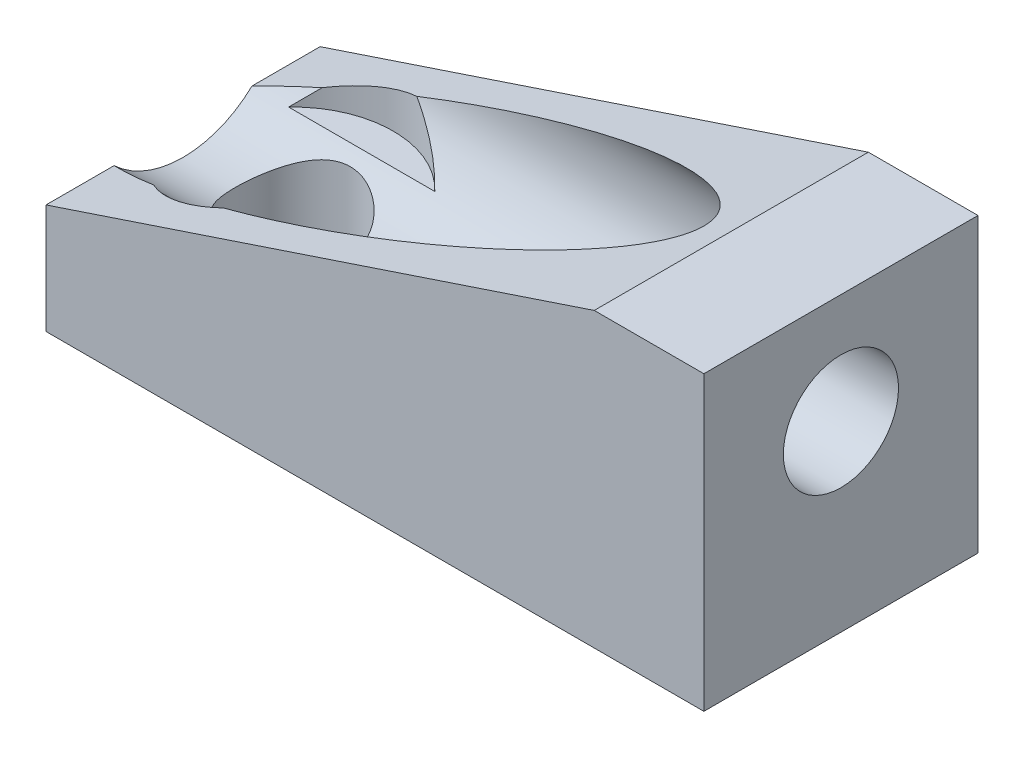
ISO-10303-21;
HEADER;
FILE_DESCRIPTION(('STEP AP214'),'2;1');
FILE_NAME('part.step','',(''),(''),'','','');
FILE_SCHEMA(('AUTOMOTIVE_DESIGN { 1 0 10303 214 1 1 1 1 }'));
ENDSEC;
DATA;
#1=APPLICATION_CONTEXT('core data for automotive mechanical design processes');
#2=APPLICATION_PROTOCOL_DEFINITION('international standard','automotive_design',2000,#1);
#3=PRODUCT_CONTEXT('',#1,'mechanical');
#4=PRODUCT('Part','Part','',(#3));
#5=PRODUCT_RELATED_PRODUCT_CATEGORY('part','',(#4));
#6=PRODUCT_DEFINITION_FORMATION('','',#4);
#7=PRODUCT_DEFINITION_CONTEXT('part definition',#1,'design');
#8=PRODUCT_DEFINITION('design','',#6,#7);
#9=PRODUCT_DEFINITION_SHAPE('','',#8);
#10=(LENGTH_UNIT() NAMED_UNIT(*) SI_UNIT(.MILLI.,.METRE.));
#11=(NAMED_UNIT(*) PLANE_ANGLE_UNIT() SI_UNIT($,.RADIAN.));
#12=(NAMED_UNIT(*) SI_UNIT($,.STERADIAN.) SOLID_ANGLE_UNIT());
#13=UNCERTAINTY_MEASURE_WITH_UNIT(LENGTH_MEASURE(1.E-05),#10,'distance_accuracy_value','');
#14=(GEOMETRIC_REPRESENTATION_CONTEXT(3) GLOBAL_UNCERTAINTY_ASSIGNED_CONTEXT((#13)) GLOBAL_UNIT_ASSIGNED_CONTEXT((#10,
#11,#12)) REPRESENTATION_CONTEXT('',''));
#15=CARTESIAN_POINT('',(0.,0.,0.));
#16=DIRECTION('',(0.,0.,1.));
#17=DIRECTION('',(1.,0.,0.));
#18=AXIS2_PLACEMENT_3D('',#15,#16,#17);
#19=CARTESIAN_POINT('',(8.34684153005472,6.,7.5));
#20=DIRECTION('',(0.,1.,0.));
#21=DIRECTION('',(0.,0.,1.));
#22=AXIS2_PLACEMENT_3D('',#19,#20,#21);
#23=CYLINDRICAL_SURFACE('',#22,5.5);
#24=CARTESIAN_POINT('',(8.34684153005472,10.,7.5));
#25=DIRECTION('',(-0.707106781186547,0.707106781186547,0.));
#26=DIRECTION('',(0.707106781186547,0.707106781186547,0.));
#27=AXIS2_PLACEMENT_3D('',#24,#25,#26);
#28=ELLIPSE('',#27,7.77817459305202,5.5);
#29=CARTESIAN_POINT('',(5.34684153005472,7.,12.1097722286464));
#30=VERTEX_POINT('',#29);
#31=CARTESIAN_POINT('',(4.34684153005472,6.,11.2749172176354));
#32=VERTEX_POINT('',#31);
#33=EDGE_CURVE('E63',#30,#32,#28,.F.);
#34=ORIENTED_EDGE('',*,*,#33,.F.);
#35=CARTESIAN_POINT('',(8.34684153005472,8.,7.5));
#36=DIRECTION('',(-0.316227766016838,0.948683298050514,0.));
#37=DIRECTION('',(0.948683298050514,0.316227766016838,0.));
#38=AXIS2_PLACEMENT_3D('',#35,#36,#37);
#39=ELLIPSE('',#38,5.79750904364202,5.5);
#40=CARTESIAN_POINT('',(9.84684153005471,8.5,12.7915026221292));
#41=VERTEX_POINT('',#40);
#42=EDGE_CURVE('E168',#30,#41,#39,.T.);
#43=ORIENTED_EDGE('',*,*,#42,.T.);
#44=CARTESIAN_POINT('',(8.34684153005472,10.,7.5));
#45=DIRECTION('',(0.707106781186547,0.707106781186547,0.));
#46=DIRECTION('',(-0.707106781186547,0.707106781186547,0.));
#47=AXIS2_PLACEMENT_3D('',#44,#45,#46);
#48=ELLIPSE('',#47,7.77817459305202,5.5);
#49=CARTESIAN_POINT('',(12.3468415300547,6.,11.2749172176354));
#50=VERTEX_POINT('',#49);
#51=EDGE_CURVE('E185',#50,#41,#48,.F.);
#52=ORIENTED_EDGE('',*,*,#51,.F.);
#53=CARTESIAN_POINT('',(8.34684153005472,6.,7.5));
#54=DIRECTION('',(0.,1.,0.));
#55=DIRECTION('',(0.,0.,1.));
#56=AXIS2_PLACEMENT_3D('',#53,#54,#55);
#57=CIRCLE('',#56,5.5);
#58=EDGE_CURVE('E179',#32,#50,#57,.T.);
#59=ORIENTED_EDGE('',*,*,#58,.F.);
#60=EDGE_LOOP('',(#34,#43,#52,#59));
#61=FACE_BOUND('',#60,.T.);
#62=ADVANCED_FACE('F47',(#61),#23,.F.);
#63=CARTESIAN_POINT('',(4.34684153005472,6.,3.72508278236463));
#64=VERTEX_POINT('',#63);
#65=CARTESIAN_POINT('',(5.34684153005474,7.00000000000001,2.89022777135355));
#66=VERTEX_POINT('',#65);
#67=EDGE_CURVE('E244',#64,#66,#28,.F.);
#68=ORIENTED_EDGE('',*,*,#67,.F.);
#69=CARTESIAN_POINT('',(12.3468415300547,6.,3.72508278236463));
#70=VERTEX_POINT('',#69);
#71=EDGE_CURVE('E172',#70,#64,#57,.T.);
#72=ORIENTED_EDGE('',*,*,#71,.F.);
#73=CARTESIAN_POINT('',(9.84684153005469,8.49999999999999,2.20849737787082));
#74=VERTEX_POINT('',#73);
#75=EDGE_CURVE('E273',#74,#70,#48,.F.);
#76=ORIENTED_EDGE('',*,*,#75,.F.);
#77=EDGE_CURVE('E171',#74,#66,#39,.T.);
#78=ORIENTED_EDGE('',*,*,#77,.T.);
#79=EDGE_LOOP('',(#68,#72,#76,#78));
#80=FACE_BOUND('',#79,.T.);
#81=ADVANCED_FACE('F224',(#80),#23,.F.);
#82=CARTESIAN_POINT('',(8.34684153005472,0.,7.5));
#83=DIRECTION('',(0.,1.,0.));
#84=DIRECTION('',(0.,0.,1.));
#85=AXIS2_PLACEMENT_3D('',#82,#83,#84);
#86=CYLINDRICAL_SURFACE('',#85,3.15);
#87=CARTESIAN_POINT('',(8.34684153005472,0.,7.5));
#88=DIRECTION('',(0.,1.,0.));
#89=DIRECTION('',(0.,0.,1.));
#90=AXIS2_PLACEMENT_3D('',#87,#88,#89);
#91=CIRCLE('',#90,3.15);
#92=CARTESIAN_POINT('',(8.34684153005472,0.,10.65));
#93=VERTEX_POINT('',#92);
#94=EDGE_CURVE('E146',#93,#93,#91,.T.);
#95=ORIENTED_EDGE('',*,*,#94,.F.);
#96=EDGE_LOOP('',(#95));
#97=FACE_BOUND('',#96,.T.);
#98=CARTESIAN_POINT('',(8.34684153005472,5.49139711218653,10.65));
#99=CARTESIAN_POINT('',(8.18664831508486,5.49139257363242,10.6499971573906));
#100=CARTESIAN_POINT('',(8.02643474156339,5.48273059758535,10.6377036449185));
#101=CARTESIAN_POINT('',(7.71128135945185,5.44953139309211,10.5893443951995));
#102=CARTESIAN_POINT('',(7.55634732894285,5.42497732436852,10.5532534398986));
#103=CARTESIAN_POINT('',(7.25691988313046,5.36383579399984,10.4595692648666));
#104=CARTESIAN_POINT('',(7.11236556893252,5.32732697300876,10.4021162429013));
#105=CARTESIAN_POINT('',(6.83500808623603,5.2465277213798,10.2677854027492));
#106=CARTESIAN_POINT('',(6.70220870911394,5.20223479374879,10.1909013479798));
#107=CARTESIAN_POINT('',(6.4360373568799,5.10493482199459,10.0099782815594));
#108=CARTESIAN_POINT('',(6.30421862765011,5.05150551034775,9.90387918887579));
#109=CARTESIAN_POINT('',(6.05899152567842,4.94534520413919,9.67181796694587));
#110=CARTESIAN_POINT('',(5.94559521713512,4.89261468778374,9.54584292721));
#111=CARTESIAN_POINT('',(5.72969351333924,4.78778236091095,9.26282643368914));
#112=CARTESIAN_POINT('',(5.6292601798224,4.73622077652977,9.10396754038046));
#113=CARTESIAN_POINT('',(5.50032185377552,4.66812729891293,8.85231191146788));
#114=CARTESIAN_POINT('',(5.46095171467928,4.64696555633022,8.76616849586087));
#115=CARTESIAN_POINT('',(5.38991242520251,4.6083365445564,8.58998665364463));
#116=CARTESIAN_POINT('',(5.35823841443073,4.59086694455236,8.49995072784799));
#117=CARTESIAN_POINT('',(5.30549073970142,4.56153702625783,8.32480304783756));
#118=CARTESIAN_POINT('',(5.28372823485863,4.54931772330067,8.23995802727876));
#119=CARTESIAN_POINT('',(5.2472959973451,4.52876102493521,8.06833711325558));
#120=CARTESIAN_POINT('',(5.23262245675155,4.5204215455221,7.98156228267541));
#121=CARTESIAN_POINT('',(5.2105851190094,4.50786738514357,7.80682609112671));
#122=CARTESIAN_POINT('',(5.20321798822331,4.50365082305983,7.71886528985736));
#123=CARTESIAN_POINT('',(5.19589164066333,4.49945622119809,7.54256408221431));
#124=CARTESIAN_POINT('',(5.19593176600806,4.49947780500577,7.45422371024938));
#125=CARTESIAN_POINT('',(5.20634976021134,4.50544628196951,7.20985753378604));
#126=CARTESIAN_POINT('',(5.22467861556028,4.515951303239,7.0541890184544));
#127=CARTESIAN_POINT('',(5.28378948351538,4.54938436183451,6.74868279503025));
#128=CARTESIAN_POINT('',(5.32457314854227,4.5723133134197,6.59884551691996));
#129=CARTESIAN_POINT('',(5.4272600052696,4.62881729232859,6.30725346029636));
#130=CARTESIAN_POINT('',(5.48934498105064,4.66248377290525,6.1655809336594));
#131=CARTESIAN_POINT('',(5.63239816430101,4.73768064256382,5.89443852130714));
#132=CARTESIAN_POINT('',(5.71337191093747,4.77921333775453,5.76497223076163));
#133=CARTESIAN_POINT('',(5.90230906143859,4.87206576204514,5.50619541147349));
#134=CARTESIAN_POINT('',(6.01229137027956,4.92396122995949,5.37856593651393));
#135=CARTESIAN_POINT('',(6.25088123291657,5.02917742410591,5.14253049478517));
#136=CARTESIAN_POINT('',(6.379511475824,5.0824998211071,5.03414830902544));
#137=CARTESIAN_POINT('',(6.66716144391248,5.19070644769958,4.8287704851188));
#138=CARTESIAN_POINT('',(6.82793546974697,5.24521036733566,4.73400918730905));
#139=CARTESIAN_POINT('',(7.1665965031691,5.34227584292433,4.57348838489456));
#140=CARTESIAN_POINT('',(7.34445241974998,5.38485856363631,4.50767736204481));
#141=CARTESIAN_POINT('',(7.67014442527354,5.44303110242556,4.42004333159355));
#142=CARTESIAN_POINT('',(7.81549199132265,5.46257444083781,4.39158859670226));
#143=CARTESIAN_POINT('',(8.10988891585925,5.48754776751622,4.35543516020521));
#144=CARTESIAN_POINT('',(8.25893455226124,5.49299140822564,4.34771638013726));
#145=CARTESIAN_POINT('',(8.55649012263596,5.48898103623461,4.3534599995503));
#146=CARTESIAN_POINT('',(8.7049996654793,5.47951774973305,4.36693558432431));
#147=CARTESIAN_POINT('',(8.99722315723903,5.44705112609846,4.41431473475166));
#148=CARTESIAN_POINT('',(9.14093351656548,5.42403788368982,4.44823324500171));
#149=CARTESIAN_POINT('',(9.42192111264384,5.3670643274878,4.53543887147296));
#150=CARTESIAN_POINT('',(9.55910068144205,5.3329761982519,4.58895310632539));
#151=CARTESIAN_POINT('',(9.82307423167685,5.2575610947238,4.71350254717481));
#152=CARTESIAN_POINT('',(9.94986396263122,5.21623117930196,4.78454487671522));
#153=CARTESIAN_POINT('',(10.2118530052978,5.12266648616004,4.95586206033776));
#154=CARTESIAN_POINT('',(10.3449230318329,5.0697630455231,5.059037064315));
#155=CARTESIAN_POINT('',(10.5931010296811,4.96407266922299,5.2852600296278));
#156=CARTESIAN_POINT('',(10.7081938655326,4.91128586822718,5.40832456101043));
#157=CARTESIAN_POINT('',(10.9288063701012,4.80541235238786,5.68605288479989));
#158=CARTESIAN_POINT('',(11.0321805000033,4.75283527297227,5.84265376038058));
#159=CARTESIAN_POINT('',(11.1658616706313,4.68276782326929,6.09127183827232));
#160=CARTESIAN_POINT('',(11.2068689265662,4.66087247920071,6.17646165448096));
#161=CARTESIAN_POINT('',(11.2812915084629,4.62064031146847,6.35088148024911));
#162=CARTESIAN_POINT('',(11.3147115576061,4.60230127497792,6.44010893457579));
#163=CARTESIAN_POINT('',(11.3711155666931,4.57107477029878,6.61457150590036));
#164=CARTESIAN_POINT('',(11.3947239102335,4.55786687293565,6.69954804396214));
#165=CARTESIAN_POINT('',(11.4347944251916,4.53532449546436,6.87163234598352));
#166=CARTESIAN_POINT('',(11.4512604461413,4.52598792892631,6.95873893508767));
#167=CARTESIAN_POINT('',(11.476801908852,4.51146286005934,7.13433503819709));
#168=CARTESIAN_POINT('',(11.4858810427839,4.5062722854724,7.22282383876434));
#169=CARTESIAN_POINT('',(11.4965233913976,4.50018340345267,7.40036921251356));
#170=CARTESIAN_POINT('',(11.4980873479588,4.49928467233994,7.48942572878293));
#171=CARTESIAN_POINT('',(11.4919474517821,4.50280601019825,7.73532485425561));
#172=CARTESIAN_POINT('',(11.4762540238322,4.51181198577021,7.89199698097801));
#173=CARTESIAN_POINT('',(11.422078338485,4.54251887223659,8.19994030797412));
#174=CARTESIAN_POINT('',(11.3835949205651,4.56422042962078,8.35121123278929));
#175=CARTESIAN_POINT('',(11.2855286591108,4.61839128086366,8.64481246924984));
#176=CARTESIAN_POINT('',(11.2259262770375,4.65087054411218,8.78713435749964));
#177=CARTESIAN_POINT('',(11.087743449961,4.72395886238293,9.05992550856212));
#178=CARTESIAN_POINT('',(11.0091578607196,4.76457012057419,9.19039154535987));
#179=CARTESIAN_POINT('',(10.8254717180251,4.85567750567856,9.45116659544025));
#180=CARTESIAN_POINT('',(10.7184062220728,4.90676948741569,9.57988225265429));
#181=CARTESIAN_POINT('',(10.4856802782483,5.01088261197839,9.81855620801347));
#182=CARTESIAN_POINT('',(10.3599976615121,5.06390599712091,9.92849180251976));
#183=CARTESIAN_POINT('',(10.0778425622691,5.17246061308369,10.1382230799966));
#184=CARTESIAN_POINT('',(9.91951991699358,5.22766480467004,10.2357198123361));
#185=CARTESIAN_POINT('',(9.58544874868937,5.32705456582171,10.4022473412416));
#186=CARTESIAN_POINT('',(9.40972860982122,5.37125768277329,10.4713235866993));
#187=CARTESIAN_POINT('',(9.08616813951377,5.43328860040155,10.5655486568428));
#188=CARTESIAN_POINT('',(8.94089195946706,5.45480553872776,10.5970692841075));
#189=CARTESIAN_POINT('',(8.64602738568832,5.48385510500495,10.6392861435298));
#190=CARTESIAN_POINT('',(8.49644333560937,5.49140135066747,10.6500026546661));
#191=CARTESIAN_POINT('',(8.34684153005472,5.49139711218653,10.65));
#192=B_SPLINE_CURVE_WITH_KNOTS('',3,(#98,#99,#100,#101,#102,#103,#104,#105,#106,#107,#108,#109,
#110,#111,#112,#113,#114,#115,#116,#117,#118,#119,#120,#121,#122,#123,#124,#125,#126,#127,#128,
#129,#130,#131,#132,#133,#134,#135,#136,#137,#138,#139,#140,#141,#142,#143,#144,#145,#146,#147,
#148,#149,#150,#151,#152,#153,#154,#155,#156,#157,#158,#159,#160,#161,#162,#163,#164,#165,#166,
#167,#168,#169,#170,#171,#172,#173,#174,#175,#176,#177,#178,#179,#180,#181,#182,#183,#184,#185,
#186,#187,#188,#189,#190,#191),.UNSPECIFIED.,.T.,.F.,(4,2,2,2,2,2,2,2,2,2,2,2,2,2,2,2,2,2,2,2,2,
2,2,2,2,2,2,2,2,2,2,2,2,2,2,2,2,2,2,2,2,2,2,2,2,2,4),(0.,0.479953962081295,0.960417348594958,
1.43778160002681,1.91529926125804,2.44549965864656,2.9760458782152,3.55722301635843,
3.84800161111789,4.13859608827814,4.40354331419114,4.66834806181925,4.93303193343067,
5.19769229694321,5.66652011398333,6.13538243607498,6.60834984755052,7.08145613234856,
7.60818879767181,8.13556780751899,8.71587373135105,9.29514275684576,9.741353379834,
10.1871317845851,10.6331876236559,11.0795699435862,11.531298738469,11.9832114224517,
12.5105621759985,13.0383545540234,13.6195276859496,13.9103101334725,14.2009110639325,
14.4680697803691,14.7350843255254,15.0019653272769,15.2688199826657,15.7394621713832,
16.2101283284273,16.6812310714676,17.1524616216117,17.6754857872719,18.1991378413651,
18.7781227795566,19.356178195636,19.8048368510512,20.253057952825),.UNSPECIFIED.);
#193=CARTESIAN_POINT('',(8.34684153005472,5.49139711218653,10.65));
#194=VERTEX_POINT('',#193);
#195=EDGE_CURVE('E193',#194,#194,#192,.T.);
#196=ORIENTED_EDGE('',*,*,#195,.F.);
#197=EDGE_LOOP('',(#196));
#198=FACE_BOUND('',#197,.T.);
#199=ADVANCED_FACE('F217',(#97,#198),#86,.F.);
#200=CARTESIAN_POINT('',(-1.56531584699453,4.69594754098359,15.));
#201=DIRECTION('',(-0.316227766016838,0.948683298050514,0.));
#202=DIRECTION('',(-0.948683298050514,-0.316227766016838,0.));
#203=AXIS2_PLACEMENT_3D('',#200,#201,#202);
#204=PLANE('',#203);
#205=DIRECTION('',(0.,0.,-1.));
#206=VECTOR('',#205,1.);
#207=CARTESIAN_POINT('',(2.34684153005471,6.,15.));
#208=LINE('',#207,#206);
#209=CARTESIAN_POINT('',(2.34684153005471,6.,3.72508278236463));
#210=VERTEX_POINT('',#209);
#211=CARTESIAN_POINT('',(2.34684153005471,6.,0.));
#212=VERTEX_POINT('',#211);
#213=EDGE_CURVE('E165',#210,#212,#208,.T.);
#214=ORIENTED_EDGE('',*,*,#213,.F.);
#215=CARTESIAN_POINT('',(14.3468415300547,10.,7.5));
#216=DIRECTION('',(-0.316227766016838,0.948683298050514,0.));
#217=DIRECTION('',(-0.948683298050514,-0.316227766016838,0.));
#218=AXIS2_PLACEMENT_3D('',#215,#216,#217);
#219=ELLIPSE('',#218,17.3925271309261,5.5);
#220=EDGE_CURVE('E281',#210,#66,#219,.F.);
#221=ORIENTED_EDGE('',*,*,#220,.T.);
#222=ORIENTED_EDGE('',*,*,#77,.F.);
#223=EDGE_CURVE('E280',#74,#41,#219,.F.);
#224=ORIENTED_EDGE('',*,*,#223,.T.);
#225=ORIENTED_EDGE('',*,*,#42,.F.);
#226=CARTESIAN_POINT('',(2.34684153005471,6.,11.2749172176354));
#227=VERTEX_POINT('',#226);
#228=EDGE_CURVE('E278',#30,#227,#219,.F.);
#229=ORIENTED_EDGE('',*,*,#228,.T.);
#230=CARTESIAN_POINT('',(2.34684153005471,6.,15.));
#231=VERTEX_POINT('',#230);
#232=EDGE_CURVE('E103',#231,#227,#208,.T.);
#233=ORIENTED_EDGE('',*,*,#232,.F.);
#234=DIRECTION('',(0.948683298050514,0.316227766016838,0.));
#235=VECTOR('',#234,1.);
#236=CARTESIAN_POINT('',(-1.56531584699453,4.69594754098359,15.));
#237=LINE('',#236,#235);
#238=CARTESIAN_POINT('',(32.3468415300547,16.,15.));
#239=VERTEX_POINT('',#238);
#240=EDGE_CURVE('E158',#231,#239,#237,.T.);
#241=ORIENTED_EDGE('',*,*,#240,.T.);
#242=DIRECTION('',(0.,0.,-1.));
#243=VECTOR('',#242,1.);
#244=CARTESIAN_POINT('',(32.3468415300547,16.,15.));
#245=LINE('',#244,#243);
#246=CARTESIAN_POINT('',(32.3468415300547,16.,0.));
#247=VERTEX_POINT('',#246);
#248=EDGE_CURVE('E96',#239,#247,#245,.T.);
#249=ORIENTED_EDGE('',*,*,#248,.T.);
#250=DIRECTION('',(0.948683298050514,0.316227766016838,0.));
#251=VECTOR('',#250,1.);
#252=CARTESIAN_POINT('',(-1.56531584699453,4.69594754098359,0.));
#253=LINE('',#252,#251);
#254=EDGE_CURVE('E141',#212,#247,#253,.T.);
#255=ORIENTED_EDGE('',*,*,#254,.F.);
#256=EDGE_LOOP('',(#214,#221,#222,#224,#225,#229,#233,#241,#249,#255));
#257=FACE_BOUND('',#256,.T.);
#258=ADVANCED_FACE('F49',(#257),#204,.T.);
#259=CARTESIAN_POINT('',(8.34684153005472,6.,7.5));
#260=DIRECTION('',(0.,1.,0.));
#261=DIRECTION('',(0.,0.,1.));
#262=AXIS2_PLACEMENT_3D('',#259,#260,#261);
#263=PLANE('',#262);
#264=ORIENTED_EDGE('',*,*,#71,.T.);
#265=DIRECTION('',(-1.,0.,0.));
#266=VECTOR('',#265,1.);
#267=CARTESIAN_POINT('',(53.9031907161588,6.,3.72508278236463));
#268=LINE('',#267,#266);
#269=EDGE_CURVE('E12',#64,#70,#268,.F.);
#270=ORIENTED_EDGE('',*,*,#269,.T.);
#271=EDGE_LOOP('',(#264,#270));
#272=FACE_BOUND('',#271,.T.);
#273=ADVANCED_FACE('F216',(#272),#263,.T.);
#274=ORIENTED_EDGE('',*,*,#58,.T.);
#275=DIRECTION('',(-1.,0.,0.));
#276=VECTOR('',#275,1.);
#277=CARTESIAN_POINT('',(53.9031907161588,6.,11.2749172176354));
#278=LINE('',#277,#276);
#279=EDGE_CURVE('E56',#50,#32,#278,.T.);
#280=ORIENTED_EDGE('',*,*,#279,.T.);
#281=EDGE_LOOP('',(#274,#280));
#282=FACE_BOUND('',#281,.T.);
#283=ADVANCED_FACE('F177',(#282),#263,.T.);
#284=CARTESIAN_POINT('',(38.3468415300547,10.,7.5));
#285=DIRECTION('',(-1.,0.,0.));
#286=DIRECTION('',(0.,0.,1.));
#287=AXIS2_PLACEMENT_3D('',#284,#285,#286);
#288=CYLINDRICAL_SURFACE('',#287,3.15);
#289=CARTESIAN_POINT('',(38.3468415300547,10.,7.5));
#290=DIRECTION('',(1.,0.,0.));
#291=DIRECTION('',(0.,0.,-1.));
#292=AXIS2_PLACEMENT_3D('',#289,#290,#291);
#293=CIRCLE('',#292,3.15);
#294=CARTESIAN_POINT('',(38.3468415300547,10.,4.35));
#295=VERTEX_POINT('',#294);
#296=EDGE_CURVE('E187',#295,#295,#293,.T.);
#297=ORIENTED_EDGE('',*,*,#296,.T.);
#298=EDGE_LOOP('',(#297));
#299=FACE_BOUND('',#298,.T.);
#300=CARTESIAN_POINT('',(32.3468415300547,10.,7.5));
#301=DIRECTION('',(-1.,0.,0.));
#302=DIRECTION('',(0.,0.,1.));
#303=AXIS2_PLACEMENT_3D('',#300,#301,#302);
#304=CIRCLE('',#303,3.15);
#305=CARTESIAN_POINT('',(32.3468415300547,10.,10.65));
#306=VERTEX_POINT('',#305);
#307=EDGE_CURVE('E266',#306,#306,#304,.T.);
#308=ORIENTED_EDGE('',*,*,#307,.T.);
#309=EDGE_LOOP('',(#308));
#310=FACE_BOUND('',#309,.T.);
#311=ADVANCED_FACE('F255',(#299,#310),#288,.F.);
#312=CARTESIAN_POINT('',(2.34684153005471,0.,15.));
#313=DIRECTION('',(-1.,0.,0.));
#314=DIRECTION('',(0.,0.,1.));
#315=AXIS2_PLACEMENT_3D('',#312,#313,#314);
#316=PLANE('',#315);
#317=ORIENTED_EDGE('',*,*,#232,.T.);
#318=CARTESIAN_POINT('',(2.34684153005471,10.,7.5));
#319=DIRECTION('',(-1.,0.,0.));
#320=DIRECTION('',(0.,0.,1.));
#321=AXIS2_PLACEMENT_3D('',#318,#319,#320);
#322=CIRCLE('',#321,5.5);
#323=EDGE_CURVE('E245',#227,#210,#322,.F.);
#324=ORIENTED_EDGE('',*,*,#323,.T.);
#325=ORIENTED_EDGE('',*,*,#213,.T.);
#326=DIRECTION('',(0.,1.,0.));
#327=VECTOR('',#326,1.);
#328=CARTESIAN_POINT('',(2.34684153005471,0.,0.));
#329=LINE('',#328,#327);
#330=CARTESIAN_POINT('',(2.34684153005471,0.,0.));
#331=VERTEX_POINT('',#330);
#332=EDGE_CURVE('E145',#331,#212,#329,.T.);
#333=ORIENTED_EDGE('',*,*,#332,.F.);
#334=DIRECTION('',(0.,0.,-1.));
#335=VECTOR('',#334,1.);
#336=CARTESIAN_POINT('',(2.34684153005471,0.,15.));
#337=LINE('',#336,#335);
#338=CARTESIAN_POINT('',(2.34684153005471,0.,15.));
#339=VERTEX_POINT('',#338);
#340=EDGE_CURVE('E130',#339,#331,#337,.T.);
#341=ORIENTED_EDGE('',*,*,#340,.F.);
#342=DIRECTION('',(0.,1.,0.));
#343=VECTOR('',#342,1.);
#344=CARTESIAN_POINT('',(2.34684153005471,0.,15.));
#345=LINE('',#344,#343);
#346=EDGE_CURVE('E118',#339,#231,#345,.T.);
#347=ORIENTED_EDGE('',*,*,#346,.T.);
#348=EDGE_LOOP('',(#317,#324,#325,#333,#341,#347));
#349=FACE_BOUND('',#348,.T.);
#350=ADVANCED_FACE('F203',(#349),#316,.T.);
#351=CARTESIAN_POINT('',(0.,0.,15.));
#352=DIRECTION('',(0.,1.,0.));
#353=DIRECTION('',(0.,0.,1.));
#354=AXIS2_PLACEMENT_3D('',#351,#352,#353);
#355=PLANE('',#354);
#356=ORIENTED_EDGE('',*,*,#94,.T.);
#357=EDGE_LOOP('',(#356));
#358=FACE_BOUND('',#357,.T.);
#359=DIRECTION('',(1.,0.,0.));
#360=VECTOR('',#359,1.);
#361=CARTESIAN_POINT('',(0.,0.,0.));
#362=LINE('',#361,#360);
#363=CARTESIAN_POINT('',(38.3468415300547,0.,0.));
#364=VERTEX_POINT('',#363);
#365=EDGE_CURVE('E126',#331,#364,#362,.T.);
#366=ORIENTED_EDGE('',*,*,#365,.T.);
#367=DIRECTION('',(0.,0.,-1.));
#368=VECTOR('',#367,1.);
#369=CARTESIAN_POINT('',(38.3468415300547,0.,15.));
#370=LINE('',#369,#368);
#371=CARTESIAN_POINT('',(38.3468415300547,0.,15.));
#372=VERTEX_POINT('',#371);
#373=EDGE_CURVE('E123',#372,#364,#370,.T.);
#374=ORIENTED_EDGE('',*,*,#373,.F.);
#375=DIRECTION('',(1.,0.,0.));
#376=VECTOR('',#375,1.);
#377=CARTESIAN_POINT('',(0.,0.,15.));
#378=LINE('',#377,#376);
#379=EDGE_CURVE('E111',#339,#372,#378,.T.);
#380=ORIENTED_EDGE('',*,*,#379,.F.);
#381=ORIENTED_EDGE('',*,*,#340,.T.);
#382=EDGE_LOOP('',(#366,#374,#380,#381));
#383=FACE_BOUND('',#382,.T.);
#384=ADVANCED_FACE('F124',(#358,#383),#355,.F.);
#385=CARTESIAN_POINT('',(38.3468415300547,0.,15.));
#386=DIRECTION('',(-1.,0.,0.));
#387=DIRECTION('',(0.,0.,1.));
#388=AXIS2_PLACEMENT_3D('',#385,#386,#387);
#389=PLANE('',#388);
#390=ORIENTED_EDGE('',*,*,#296,.F.);
#391=EDGE_LOOP('',(#390));
#392=FACE_BOUND('',#391,.T.);
#393=DIRECTION('',(0.,1.,0.));
#394=VECTOR('',#393,1.);
#395=CARTESIAN_POINT('',(38.3468415300547,0.,0.));
#396=LINE('',#395,#394);
#397=CARTESIAN_POINT('',(38.3468415300547,16.,0.));
#398=VERTEX_POINT('',#397);
#399=EDGE_CURVE('E152',#364,#398,#396,.T.);
#400=ORIENTED_EDGE('',*,*,#399,.T.);
#401=DIRECTION('',(0.,0.,-1.));
#402=VECTOR('',#401,1.);
#403=CARTESIAN_POINT('',(38.3468415300547,16.,15.));
#404=LINE('',#403,#402);
#405=CARTESIAN_POINT('',(38.3468415300547,16.,15.));
#406=VERTEX_POINT('',#405);
#407=EDGE_CURVE('E131',#406,#398,#404,.T.);
#408=ORIENTED_EDGE('',*,*,#407,.F.);
#409=DIRECTION('',(0.,1.,0.));
#410=VECTOR('',#409,1.);
#411=CARTESIAN_POINT('',(38.3468415300547,0.,15.));
#412=LINE('',#411,#410);
#413=EDGE_CURVE('E115',#372,#406,#412,.T.);
#414=ORIENTED_EDGE('',*,*,#413,.F.);
#415=ORIENTED_EDGE('',*,*,#373,.T.);
#416=EDGE_LOOP('',(#400,#408,#414,#415));
#417=FACE_BOUND('',#416,.T.);
#418=ADVANCED_FACE('F133',(#392,#417),#389,.F.);
#419=CARTESIAN_POINT('',(0.,16.,15.));
#420=DIRECTION('',(0.,-1.,0.));
#421=DIRECTION('',(0.,0.,-1.));
#422=AXIS2_PLACEMENT_3D('',#419,#420,#421);
#423=PLANE('',#422);
#424=DIRECTION('',(-1.,0.,0.));
#425=VECTOR('',#424,1.);
#426=CARTESIAN_POINT('',(0.,16.,0.));
#427=LINE('',#426,#425);
#428=EDGE_CURVE('E155',#398,#247,#427,.T.);
#429=ORIENTED_EDGE('',*,*,#428,.T.);
#430=ORIENTED_EDGE('',*,*,#248,.F.);
#431=DIRECTION('',(-1.,0.,0.));
#432=VECTOR('',#431,1.);
#433=CARTESIAN_POINT('',(0.,16.,15.));
#434=LINE('',#433,#432);
#435=EDGE_CURVE('E72',#406,#239,#434,.T.);
#436=ORIENTED_EDGE('',*,*,#435,.F.);
#437=ORIENTED_EDGE('',*,*,#407,.T.);
#438=EDGE_LOOP('',(#429,#430,#436,#437));
#439=FACE_BOUND('',#438,.T.);
#440=ADVANCED_FACE('F211',(#439),#423,.F.);
#441=CARTESIAN_POINT('',(0.,0.,15.));
#442=DIRECTION('',(0.,0.,1.));
#443=DIRECTION('',(1.,0.,0.));
#444=AXIS2_PLACEMENT_3D('',#441,#442,#443);
#445=PLANE('',#444);
#446=ORIENTED_EDGE('',*,*,#240,.F.);
#447=ORIENTED_EDGE('',*,*,#346,.F.);
#448=ORIENTED_EDGE('',*,*,#379,.T.);
#449=ORIENTED_EDGE('',*,*,#413,.T.);
#450=ORIENTED_EDGE('',*,*,#435,.T.);
#451=EDGE_LOOP('',(#446,#447,#448,#449,#450));
#452=FACE_BOUND('',#451,.T.);
#453=ADVANCED_FACE('F113',(#452),#445,.T.);
#454=CARTESIAN_POINT('',(0.,0.,0.));
#455=DIRECTION('',(0.,0.,1.));
#456=DIRECTION('',(1.,0.,0.));
#457=AXIS2_PLACEMENT_3D('',#454,#455,#456);
#458=PLANE('',#457);
#459=ORIENTED_EDGE('',*,*,#254,.T.);
#460=ORIENTED_EDGE('',*,*,#428,.F.);
#461=ORIENTED_EDGE('',*,*,#399,.F.);
#462=ORIENTED_EDGE('',*,*,#365,.F.);
#463=ORIENTED_EDGE('',*,*,#332,.T.);
#464=EDGE_LOOP('',(#459,#460,#461,#462,#463));
#465=FACE_BOUND('',#464,.T.);
#466=ADVANCED_FACE('F208',(#465),#458,.F.);
#467=CARTESIAN_POINT('',(53.9031907161588,10.,7.5));
#468=DIRECTION('',(-1.,0.,0.));
#469=DIRECTION('',(0.,0.,1.));
#470=AXIS2_PLACEMENT_3D('',#467,#468,#469);
#471=CYLINDRICAL_SURFACE('',#470,5.5);
#472=CARTESIAN_POINT('',(32.3468415300547,10.,7.5));
#473=DIRECTION('',(-1.,0.,0.));
#474=DIRECTION('',(0.,0.,1.));
#475=AXIS2_PLACEMENT_3D('',#472,#473,#474);
#476=CIRCLE('',#475,5.5);
#477=CARTESIAN_POINT('',(32.3468415300547,10.,13.));
#478=VERTEX_POINT('',#477);
#479=EDGE_CURVE('E268',#478,#478,#476,.T.);
#480=ORIENTED_EDGE('',*,*,#479,.F.);
#481=EDGE_LOOP('',(#480));
#482=FACE_BOUND('',#481,.T.);
#483=ORIENTED_EDGE('',*,*,#67,.T.);
#484=ORIENTED_EDGE('',*,*,#220,.F.);
#485=ORIENTED_EDGE('',*,*,#323,.F.);
#486=ORIENTED_EDGE('',*,*,#228,.F.);
#487=ORIENTED_EDGE('',*,*,#33,.T.);
#488=ORIENTED_EDGE('',*,*,#279,.F.);
#489=ORIENTED_EDGE('',*,*,#51,.T.);
#490=ORIENTED_EDGE('',*,*,#223,.F.);
#491=ORIENTED_EDGE('',*,*,#75,.T.);
#492=ORIENTED_EDGE('',*,*,#269,.F.);
#493=EDGE_LOOP('',(#483,#484,#485,#486,#487,#488,#489,#490,#491,#492));
#494=FACE_BOUND('',#493,.T.);
#495=ORIENTED_EDGE('',*,*,#195,.T.);
#496=EDGE_LOOP('',(#495));
#497=FACE_BOUND('',#496,.T.);
#498=ADVANCED_FACE('F247',(#482,#494,#497),#471,.F.);
#499=CARTESIAN_POINT('',(32.3468415300547,0.,15.));
#500=DIRECTION('',(-1.,0.,0.));
#501=DIRECTION('',(0.,0.,1.));
#502=AXIS2_PLACEMENT_3D('',#499,#500,#501);
#503=PLANE('',#502);
#504=ORIENTED_EDGE('',*,*,#307,.F.);
#505=EDGE_LOOP('',(#504));
#506=FACE_BOUND('',#505,.T.);
#507=ORIENTED_EDGE('',*,*,#479,.T.);
#508=EDGE_LOOP('',(#507));
#509=FACE_BOUND('',#508,.T.);
#510=ADVANCED_FACE('F251',(#506,#509),#503,.T.);
#511=CLOSED_SHELL('',(#62,#81,#199,#258,#273,#283,#311,#350,#384,#418,#440,#453,#466,#498,#510));
#512=MANIFOLD_SOLID_BREP('B2',#511);
#513=ADVANCED_BREP_SHAPE_REPRESENTATION('',(#18,#512),#14);
#514=SHAPE_DEFINITION_REPRESENTATION(#9,#513);
ENDSEC;
END-ISO-10303-21;
